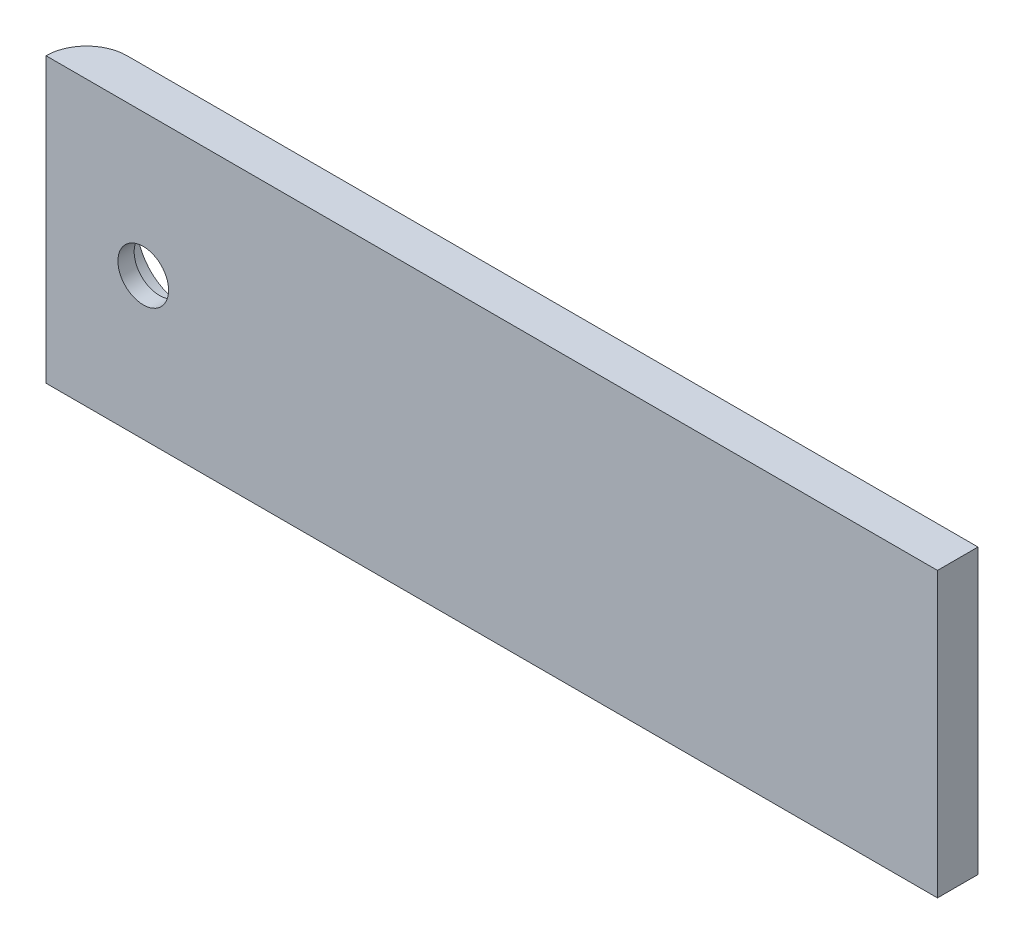
ISO-10303-21;
HEADER;
FILE_DESCRIPTION(('STEP AP214'),'2;1');
FILE_NAME('part.step','',(''),(''),'','','');
FILE_SCHEMA(('AUTOMOTIVE_DESIGN { 1 0 10303 214 1 1 1 1 }'));
ENDSEC;
DATA;
#1=APPLICATION_CONTEXT('core data for automotive mechanical design processes');
#2=APPLICATION_PROTOCOL_DEFINITION('international standard','automotive_design',2000,#1);
#3=PRODUCT_CONTEXT('',#1,'mechanical');
#4=PRODUCT('Part','Part','',(#3));
#5=PRODUCT_RELATED_PRODUCT_CATEGORY('part','',(#4));
#6=PRODUCT_DEFINITION_FORMATION('','',#4);
#7=PRODUCT_DEFINITION_CONTEXT('part definition',#1,'design');
#8=PRODUCT_DEFINITION('design','',#6,#7);
#9=PRODUCT_DEFINITION_SHAPE('','',#8);
#10=(LENGTH_UNIT() NAMED_UNIT(*) SI_UNIT(.MILLI.,.METRE.));
#11=(NAMED_UNIT(*) PLANE_ANGLE_UNIT() SI_UNIT($,.RADIAN.));
#12=(NAMED_UNIT(*) SI_UNIT($,.STERADIAN.) SOLID_ANGLE_UNIT());
#13=UNCERTAINTY_MEASURE_WITH_UNIT(LENGTH_MEASURE(1.E-05),#10,'distance_accuracy_value','');
#14=(GEOMETRIC_REPRESENTATION_CONTEXT(3) GLOBAL_UNCERTAINTY_ASSIGNED_CONTEXT((#13)) GLOBAL_UNIT_ASSIGNED_CONTEXT((#10,
#11,#12)) REPRESENTATION_CONTEXT('',''));
#15=CARTESIAN_POINT('',(0.,0.,0.));
#16=DIRECTION('',(0.,0.,1.));
#17=DIRECTION('',(1.,0.,0.));
#18=AXIS2_PLACEMENT_3D('',#15,#16,#17);
#19=CARTESIAN_POINT('',(15.2400000000004,22.225,-114.3));
#20=DIRECTION('',(0.,0.,1.));
#21=DIRECTION('',(1.,0.,0.));
#22=AXIS2_PLACEMENT_3D('',#19,#20,#21);
#23=CYLINDRICAL_SURFACE('',#22,3.96874999999998);
#24=CARTESIAN_POINT('',(15.2400000000004,22.225,0.));
#25=DIRECTION('',(0.,0.,-1.));
#26=DIRECTION('',(-1.,0.,0.));
#27=AXIS2_PLACEMENT_3D('',#24,#25,#26);
#28=CIRCLE('',#27,3.96874999999998);
#29=CARTESIAN_POINT('',(11.2712500000004,22.225,0.));
#30=VERTEX_POINT('',#29);
#31=EDGE_CURVE('E106',#30,#30,#28,.T.);
#32=ORIENTED_EDGE('',*,*,#31,.F.);
#33=EDGE_LOOP('',(#32));
#34=FACE_BOUND('',#33,.T.);
#35=CARTESIAN_POINT('',(15.2400000000004,22.225,-2.54));
#36=DIRECTION('',(0.,0.,-1.));
#37=DIRECTION('',(-1.,0.,0.));
#38=AXIS2_PLACEMENT_3D('',#35,#36,#37);
#39=CIRCLE('',#38,3.96874999999998);
#40=CARTESIAN_POINT('',(11.2712500000004,22.225,-2.54));
#41=VERTEX_POINT('',#40);
#42=EDGE_CURVE('E39',#41,#41,#39,.F.);
#43=ORIENTED_EDGE('',*,*,#42,.F.);
#44=EDGE_LOOP('',(#43));
#45=FACE_BOUND('',#44,.T.);
#46=ADVANCED_FACE('F35',(#34,#45),#23,.F.);
#47=CARTESIAN_POINT('',(0.,44.45,0.));
#48=DIRECTION('',(0.,0.,-1.));
#49=DIRECTION('',(-1.,0.,0.));
#50=AXIS2_PLACEMENT_3D('',#47,#48,#49);
#51=PLANE('',#50);
#52=ORIENTED_EDGE('',*,*,#31,.T.);
#53=EDGE_LOOP('',(#52));
#54=FACE_BOUND('',#53,.T.);
#55=DIRECTION('',(1.,0.,0.));
#56=VECTOR('',#55,1.);
#57=CARTESIAN_POINT('',(0.,0.,0.));
#58=LINE('',#57,#56);
#59=CARTESIAN_POINT('',(0.,0.,0.));
#60=VERTEX_POINT('',#59);
#61=CARTESIAN_POINT('',(139.7,0.,0.));
#62=VERTEX_POINT('',#61);
#63=EDGE_CURVE('E104',#60,#62,#58,.T.);
#64=ORIENTED_EDGE('',*,*,#63,.T.);
#65=DIRECTION('',(0.,-1.,0.));
#66=VECTOR('',#65,1.);
#67=CARTESIAN_POINT('',(139.7,44.45,0.));
#68=LINE('',#67,#66);
#69=CARTESIAN_POINT('',(139.7,44.45,0.));
#70=VERTEX_POINT('',#69);
#71=EDGE_CURVE('E88',#70,#62,#68,.T.);
#72=ORIENTED_EDGE('',*,*,#71,.F.);
#73=DIRECTION('',(1.,0.,0.));
#74=VECTOR('',#73,1.);
#75=CARTESIAN_POINT('',(0.,44.45,0.));
#76=LINE('',#75,#74);
#77=CARTESIAN_POINT('',(0.,44.45,0.));
#78=VERTEX_POINT('',#77);
#79=EDGE_CURVE('E78',#78,#70,#76,.T.);
#80=ORIENTED_EDGE('',*,*,#79,.F.);
#81=DIRECTION('',(0.,-1.,0.));
#82=VECTOR('',#81,1.);
#83=CARTESIAN_POINT('',(0.,44.45,0.));
#84=LINE('',#83,#82);
#85=EDGE_CURVE('E86',#78,#60,#84,.T.);
#86=ORIENTED_EDGE('',*,*,#85,.T.);
#87=EDGE_LOOP('',(#64,#72,#80,#86));
#88=FACE_BOUND('',#87,.T.);
#89=ADVANCED_FACE('F85',(#54,#88),#51,.F.);
#90=CARTESIAN_POINT('',(139.7,44.45,0.));
#91=DIRECTION('',(-1.,0.,0.));
#92=DIRECTION('',(0.,0.,1.));
#93=AXIS2_PLACEMENT_3D('',#90,#91,#92);
#94=PLANE('',#93);
#95=DIRECTION('',(0.,0.,-1.));
#96=VECTOR('',#95,1.);
#97=CARTESIAN_POINT('',(139.7,0.,0.));
#98=LINE('',#97,#96);
#99=CARTESIAN_POINT('',(139.7,0.,-6.35));
#100=VERTEX_POINT('',#99);
#101=EDGE_CURVE('E102',#62,#100,#98,.T.);
#102=ORIENTED_EDGE('',*,*,#101,.T.);
#103=DIRECTION('',(0.,-1.,0.));
#104=VECTOR('',#103,1.);
#105=CARTESIAN_POINT('',(139.7,44.45,-6.35));
#106=LINE('',#105,#104);
#107=CARTESIAN_POINT('',(139.7,44.45,-6.35));
#108=VERTEX_POINT('',#107);
#109=EDGE_CURVE('E95',#108,#100,#106,.T.);
#110=ORIENTED_EDGE('',*,*,#109,.F.);
#111=DIRECTION('',(0.,0.,-1.));
#112=VECTOR('',#111,1.);
#113=CARTESIAN_POINT('',(139.7,44.45,0.));
#114=LINE('',#113,#112);
#115=EDGE_CURVE('E90',#70,#108,#114,.T.);
#116=ORIENTED_EDGE('',*,*,#115,.F.);
#117=ORIENTED_EDGE('',*,*,#71,.T.);
#118=EDGE_LOOP('',(#102,#110,#116,#117));
#119=FACE_BOUND('',#118,.T.);
#120=ADVANCED_FACE('F129',(#119),#94,.F.);
#121=CARTESIAN_POINT('',(0.,44.45,-6.35));
#122=DIRECTION('',(0.,0.,1.));
#123=DIRECTION('',(1.,0.,0.));
#124=AXIS2_PLACEMENT_3D('',#121,#122,#123);
#125=PLANE('',#124);
#126=CARTESIAN_POINT('',(15.2400000000002,22.225,-6.35));
#127=DIRECTION('',(0.,0.,-1.));
#128=DIRECTION('',(-1.,0.,0.));
#129=AXIS2_PLACEMENT_3D('',#126,#127,#128);
#130=CIRCLE('',#129,7.33234841842261);
#131=CARTESIAN_POINT('',(7.90765158157761,22.225,-6.35));
#132=VERTEX_POINT('',#131);
#133=EDGE_CURVE('E111',#132,#132,#130,.T.);
#134=ORIENTED_EDGE('',*,*,#133,.F.);
#135=EDGE_LOOP('',(#134));
#136=FACE_BOUND('',#135,.T.);
#137=DIRECTION('',(-1.,0.,0.));
#138=VECTOR('',#137,1.);
#139=CARTESIAN_POINT('',(0.,0.,-6.35));
#140=LINE('',#139,#138);
#141=CARTESIAN_POINT('',(6.35,0.,-6.35));
#142=VERTEX_POINT('',#141);
#143=EDGE_CURVE('E91',#100,#142,#140,.T.);
#144=ORIENTED_EDGE('',*,*,#143,.T.);
#145=DIRECTION('',(0.,-1.,0.));
#146=VECTOR('',#145,1.);
#147=CARTESIAN_POINT('',(6.35,44.45,-6.35));
#148=LINE('',#147,#146);
#149=CARTESIAN_POINT('',(6.35,44.45,-6.35));
#150=VERTEX_POINT('',#149);
#151=EDGE_CURVE('E44',#142,#150,#148,.F.);
#152=ORIENTED_EDGE('',*,*,#151,.T.);
#153=DIRECTION('',(-1.,0.,0.));
#154=VECTOR('',#153,1.);
#155=CARTESIAN_POINT('',(0.,44.45,-6.35));
#156=LINE('',#155,#154);
#157=EDGE_CURVE('E80',#108,#150,#156,.T.);
#158=ORIENTED_EDGE('',*,*,#157,.F.);
#159=ORIENTED_EDGE('',*,*,#109,.T.);
#160=EDGE_LOOP('',(#144,#152,#158,#159));
#161=FACE_BOUND('',#160,.T.);
#162=ADVANCED_FACE('F139',(#136,#161),#125,.F.);
#163=CARTESIAN_POINT('',(0.,44.45,0.));
#164=DIRECTION('',(0.,-1.,0.));
#165=DIRECTION('',(0.,0.,-1.));
#166=AXIS2_PLACEMENT_3D('',#163,#164,#165);
#167=PLANE('',#166);
#168=ORIENTED_EDGE('',*,*,#157,.T.);
#169=CARTESIAN_POINT('',(6.35,44.45,0.));
#170=DIRECTION('',(0.,-1.,0.));
#171=DIRECTION('',(0.,0.,-1.));
#172=AXIS2_PLACEMENT_3D('',#169,#170,#171);
#173=CIRCLE('',#172,6.35);
#174=EDGE_CURVE('E11',#150,#78,#173,.F.);
#175=ORIENTED_EDGE('',*,*,#174,.T.);
#176=ORIENTED_EDGE('',*,*,#79,.T.);
#177=ORIENTED_EDGE('',*,*,#115,.T.);
#178=EDGE_LOOP('',(#168,#175,#176,#177));
#179=FACE_BOUND('',#178,.T.);
#180=ADVANCED_FACE('F77',(#179),#167,.F.);
#181=CARTESIAN_POINT('',(0.,0.,0.));
#182=DIRECTION('',(0.,-1.,0.));
#183=DIRECTION('',(0.,0.,-1.));
#184=AXIS2_PLACEMENT_3D('',#181,#182,#183);
#185=PLANE('',#184);
#186=ORIENTED_EDGE('',*,*,#63,.F.);
#187=CARTESIAN_POINT('',(6.35,0.,0.));
#188=DIRECTION('',(0.,-1.,0.));
#189=DIRECTION('',(0.,0.,-1.));
#190=AXIS2_PLACEMENT_3D('',#187,#188,#189);
#191=CIRCLE('',#190,6.35);
#192=EDGE_CURVE('E58',#60,#142,#191,.T.);
#193=ORIENTED_EDGE('',*,*,#192,.T.);
#194=ORIENTED_EDGE('',*,*,#143,.F.);
#195=ORIENTED_EDGE('',*,*,#101,.F.);
#196=EDGE_LOOP('',(#186,#193,#194,#195));
#197=FACE_BOUND('',#196,.T.);
#198=ADVANCED_FACE('F138',(#197),#185,.T.);
#199=CARTESIAN_POINT('',(6.35,44.45,0.));
#200=DIRECTION('',(0.,-1.,0.));
#201=DIRECTION('',(0.,0.,-1.));
#202=AXIS2_PLACEMENT_3D('',#199,#200,#201);
#203=CYLINDRICAL_SURFACE('',#202,6.35);
#204=ORIENTED_EDGE('',*,*,#174,.F.);
#205=ORIENTED_EDGE('',*,*,#151,.F.);
#206=ORIENTED_EDGE('',*,*,#192,.F.);
#207=ORIENTED_EDGE('',*,*,#85,.F.);
#208=EDGE_LOOP('',(#204,#205,#206,#207));
#209=FACE_BOUND('',#208,.T.);
#210=ADVANCED_FACE('F37',(#209),#203,.T.);
#211=CARTESIAN_POINT('',(15.2400000000002,22.225,-2.54));
#212=DIRECTION('',(0.,0.,-1.));
#213=DIRECTION('',(-1.,0.,0.));
#214=AXIS2_PLACEMENT_3D('',#211,#212,#213);
#215=PLANE('',#214);
#216=CARTESIAN_POINT('',(15.2400000000002,22.225,-2.54));
#217=DIRECTION('',(0.,0.,-1.));
#218=DIRECTION('',(-1.,0.,0.));
#219=AXIS2_PLACEMENT_3D('',#216,#217,#218);
#220=CIRCLE('',#219,7.33234841842261);
#221=CARTESIAN_POINT('',(7.90765158157761,22.225,-2.54));
#222=VERTEX_POINT('',#221);
#223=EDGE_CURVE('E114',#222,#222,#220,.T.);
#224=ORIENTED_EDGE('',*,*,#223,.T.);
#225=EDGE_LOOP('',(#224));
#226=FACE_BOUND('',#225,.T.);
#227=ORIENTED_EDGE('',*,*,#42,.T.);
#228=EDGE_LOOP('',(#227));
#229=FACE_BOUND('',#228,.T.);
#230=ADVANCED_FACE('F121',(#226,#229),#215,.T.);
#231=CARTESIAN_POINT('',(15.2400000000002,22.225,-2.54));
#232=DIRECTION('',(0.,0.,-1.));
#233=DIRECTION('',(-1.,0.,0.));
#234=AXIS2_PLACEMENT_3D('',#231,#232,#233);
#235=CYLINDRICAL_SURFACE('',#234,7.33234841842261);
#236=CARTESIAN_POINT('',(7.90765158157761,22.225,-2.54));
#237=CARTESIAN_POINT('',(7.90765158157761,22.225,-2.5796875));
#238=CARTESIAN_POINT('',(7.90765158157761,22.225,-2.619375));
#239=CARTESIAN_POINT('',(7.90765158157761,22.225,-2.69875));
#240=CARTESIAN_POINT('',(7.90765158157761,22.225,-2.7384375));
#241=CARTESIAN_POINT('',(7.90765158157761,22.225,-2.8178125));
#242=CARTESIAN_POINT('',(7.90765158157761,22.225,-2.8575));
#243=CARTESIAN_POINT('',(7.90765158157761,22.225,-2.936875));
#244=CARTESIAN_POINT('',(7.90765158157761,22.225,-2.9765625));
#245=CARTESIAN_POINT('',(7.90765158157761,22.225,-3.0559375));
#246=CARTESIAN_POINT('',(7.90765158157761,22.225,-3.095625));
#247=CARTESIAN_POINT('',(7.90765158157761,22.225,-3.175));
#248=CARTESIAN_POINT('',(7.90765158157761,22.225,-3.2146875));
#249=CARTESIAN_POINT('',(7.90765158157761,22.225,-3.2940625));
#250=CARTESIAN_POINT('',(7.90765158157761,22.225,-3.33375));
#251=CARTESIAN_POINT('',(7.90765158157761,22.225,-3.413125));
#252=CARTESIAN_POINT('',(7.90765158157761,22.225,-3.4528125));
#253=CARTESIAN_POINT('',(7.90765158157761,22.225,-3.5321875));
#254=CARTESIAN_POINT('',(7.90765158157761,22.225,-3.571875));
#255=CARTESIAN_POINT('',(7.90765158157761,22.225,-3.65125));
#256=CARTESIAN_POINT('',(7.90765158157761,22.225,-3.6909375));
#257=CARTESIAN_POINT('',(7.90765158157761,22.225,-3.7703125));
#258=CARTESIAN_POINT('',(7.90765158157761,22.225,-3.81));
#259=CARTESIAN_POINT('',(7.90765158157761,22.225,-3.889375));
#260=CARTESIAN_POINT('',(7.90765158157761,22.225,-3.9290625));
#261=CARTESIAN_POINT('',(7.90765158157761,22.225,-4.0084375));
#262=CARTESIAN_POINT('',(7.90765158157761,22.225,-4.048125));
#263=CARTESIAN_POINT('',(7.90765158157761,22.225,-4.1275));
#264=CARTESIAN_POINT('',(7.90765158157761,22.225,-4.1671875));
#265=CARTESIAN_POINT('',(7.90765158157761,22.225,-4.2465625));
#266=CARTESIAN_POINT('',(7.90765158157761,22.225,-4.28625));
#267=CARTESIAN_POINT('',(7.90765158157761,22.225,-4.365625));
#268=CARTESIAN_POINT('',(7.90765158157761,22.225,-4.4053125));
#269=CARTESIAN_POINT('',(7.90765158157761,22.225,-4.4846875));
#270=CARTESIAN_POINT('',(7.90765158157761,22.225,-4.524375));
#271=CARTESIAN_POINT('',(7.90765158157761,22.225,-4.60375));
#272=CARTESIAN_POINT('',(7.90765158157761,22.225,-4.6434375));
#273=CARTESIAN_POINT('',(7.90765158157761,22.225,-4.7228125));
#274=CARTESIAN_POINT('',(7.90765158157761,22.225,-4.7625));
#275=CARTESIAN_POINT('',(7.90765158157761,22.225,-4.841875));
#276=CARTESIAN_POINT('',(7.90765158157761,22.225,-4.8815625));
#277=CARTESIAN_POINT('',(7.90765158157761,22.225,-4.9609375));
#278=CARTESIAN_POINT('',(7.90765158157761,22.225,-5.000625));
#279=CARTESIAN_POINT('',(7.90765158157761,22.225,-5.08));
#280=CARTESIAN_POINT('',(7.90765158157761,22.225,-5.1196875));
#281=CARTESIAN_POINT('',(7.90765158157761,22.225,-5.1990625));
#282=CARTESIAN_POINT('',(7.90765158157761,22.225,-5.23875));
#283=CARTESIAN_POINT('',(7.90765158157761,22.225,-5.318125));
#284=CARTESIAN_POINT('',(7.90765158157761,22.225,-5.3578125));
#285=CARTESIAN_POINT('',(7.90765158157761,22.225,-5.4371875));
#286=CARTESIAN_POINT('',(7.90765158157761,22.225,-5.476875));
#287=CARTESIAN_POINT('',(7.90765158157761,22.225,-5.55625));
#288=CARTESIAN_POINT('',(7.90765158157761,22.225,-5.5959375));
#289=CARTESIAN_POINT('',(7.90765158157761,22.225,-5.6753125));
#290=CARTESIAN_POINT('',(7.90765158157761,22.225,-5.715));
#291=CARTESIAN_POINT('',(7.90765158157761,22.225,-5.794375));
#292=CARTESIAN_POINT('',(7.90765158157761,22.225,-5.8340625));
#293=CARTESIAN_POINT('',(7.90765158157761,22.225,-5.9134375));
#294=CARTESIAN_POINT('',(7.90765158157761,22.225,-5.953125));
#295=CARTESIAN_POINT('',(7.90765158157761,22.225,-6.0325));
#296=CARTESIAN_POINT('',(7.90765158157761,22.225,-6.0721875));
#297=CARTESIAN_POINT('',(7.90765158157761,22.225,-6.1515625));
#298=CARTESIAN_POINT('',(7.90765158157761,22.225,-6.19125));
#299=CARTESIAN_POINT('',(7.90765158157761,22.225,-6.270625));
#300=CARTESIAN_POINT('',(7.90765158157761,22.225,-6.3103125));
#301=CARTESIAN_POINT('',(7.90765158157761,22.225,-6.35));
#302=B_SPLINE_CURVE_WITH_KNOTS('',3,(#236,#237,#238,#239,#240,#241,#242,#243,#244,#245,#246,
#247,#248,#249,#250,#251,#252,#253,#254,#255,#256,#257,#258,#259,#260,#261,#262,#263,#264,#265,
#266,#267,#268,#269,#270,#271,#272,#273,#274,#275,#276,#277,#278,#279,#280,#281,#282,#283,#284,
#285,#286,#287,#288,#289,#290,#291,#292,#293,#294,#295,#296,#297,#298,#299,#300,#301),
.UNSPECIFIED.,.F.,.F.,(4,2,2,2,2,2,2,2,2,2,2,2,2,2,2,2,2,2,2,2,2,2,2,2,2,2,2,2,2,2,2,2,4),(0.,
0.1190625,0.238125,0.357187499999999,0.47625,0.595312499999999,0.714374999999999,
0.833437499999999,0.952499999999999,1.0715625,1.190625,1.3096875,1.42875,1.5478125,1.666875,
1.7859375,1.905,2.0240625,2.143125,2.2621875,2.38125,2.5003125,2.619375,2.7384375,2.8575,
2.9765625,3.095625,3.2146875,3.33375,3.4528125,3.571875,3.6909375,3.81),.UNSPECIFIED.);
#303=EDGE_CURVE('BSEAM134',#222,#132,#302,.T.);
#304=ORIENTED_EDGE('',*,*,#223,.F.);
#305=ORIENTED_EDGE('',*,*,#133,.T.);
#306=ORIENTED_EDGE('',*,*,#303,.T.);
#307=ORIENTED_EDGE('',*,*,#303,.F.);
#308=EDGE_LOOP('',(#304,#306,#305,#307));
#309=FACE_BOUND('',#308,.T.);
#310=ADVANCED_FACE('F134',(#309),#235,.F.);
#311=CLOSED_SHELL('',(#46,#89,#120,#162,#180,#198,#210,#230,#310));
#312=MANIFOLD_SOLID_BREP('B2',#311);
#313=ADVANCED_BREP_SHAPE_REPRESENTATION('',(#18,#312),#14);
#314=SHAPE_DEFINITION_REPRESENTATION(#9,#313);
ENDSEC;
END-ISO-10303-21;
